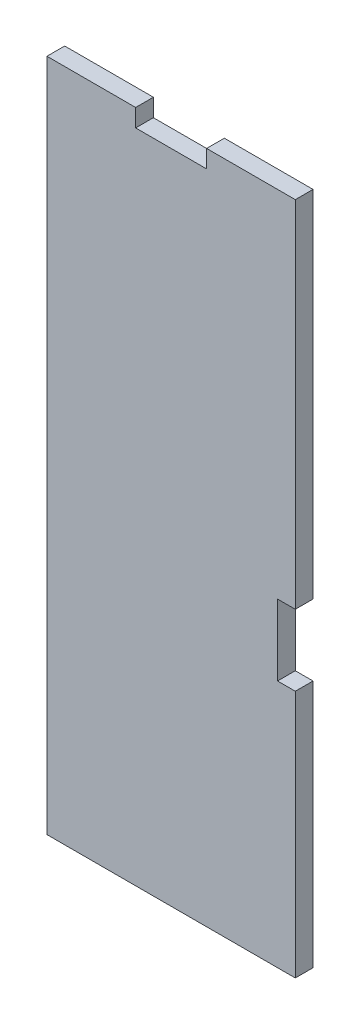
ISO-10303-21;
HEADER;
FILE_DESCRIPTION(('STEP AP214'),'2;1');
FILE_NAME('part.step','',(''),(''),'','','');
FILE_SCHEMA(('AUTOMOTIVE_DESIGN { 1 0 10303 214 1 1 1 1 }'));
ENDSEC;
DATA;
#1=APPLICATION_CONTEXT('core data for automotive mechanical design processes');
#2=APPLICATION_PROTOCOL_DEFINITION('international standard','automotive_design',2000,#1);
#3=PRODUCT_CONTEXT('',#1,'mechanical');
#4=PRODUCT('Part','Part','',(#3));
#5=PRODUCT_RELATED_PRODUCT_CATEGORY('part','',(#4));
#6=PRODUCT_DEFINITION_FORMATION('','',#4);
#7=PRODUCT_DEFINITION_CONTEXT('part definition',#1,'design');
#8=PRODUCT_DEFINITION('design','',#6,#7);
#9=PRODUCT_DEFINITION_SHAPE('','',#8);
#10=(LENGTH_UNIT() NAMED_UNIT(*) SI_UNIT(.MILLI.,.METRE.));
#11=(NAMED_UNIT(*) PLANE_ANGLE_UNIT() SI_UNIT($,.RADIAN.));
#12=(NAMED_UNIT(*) SI_UNIT($,.STERADIAN.) SOLID_ANGLE_UNIT());
#13=UNCERTAINTY_MEASURE_WITH_UNIT(LENGTH_MEASURE(1.E-05),#10,'distance_accuracy_value','');
#14=(GEOMETRIC_REPRESENTATION_CONTEXT(3) GLOBAL_UNCERTAINTY_ASSIGNED_CONTEXT((#13)) GLOBAL_UNIT_ASSIGNED_CONTEXT((#10,
#11,#12)) REPRESENTATION_CONTEXT('',''));
#15=CARTESIAN_POINT('',(0.,0.,0.));
#16=DIRECTION('',(0.,0.,1.));
#17=DIRECTION('',(1.,0.,0.));
#18=AXIS2_PLACEMENT_3D('',#15,#16,#17);
#19=CARTESIAN_POINT('',(-2.83761556371928,46.0831774343637,2.5));
#20=DIRECTION('',(-1.,0.,0.));
#21=DIRECTION('',(0.,0.,1.));
#22=AXIS2_PLACEMENT_3D('',#19,#20,#21);
#23=PLANE('',#22);
#24=DIRECTION('',(0.,1.,0.));
#25=VECTOR('',#24,1.);
#26=CARTESIAN_POINT('',(-2.83761556371928,46.0831774343637,0.));
#27=LINE('',#26,#25);
#28=CARTESIAN_POINT('',(-2.83761556371928,-3.91682256563627,0.));
#29=VERTEX_POINT('',#28);
#30=CARTESIAN_POINT('',(-2.83761556371928,46.0831774343637,0.));
#31=VERTEX_POINT('',#30);
#32=EDGE_CURVE('E157',#29,#31,#27,.T.);
#33=ORIENTED_EDGE('',*,*,#32,.T.);
#34=DIRECTION('',(0.,0.,-1.));
#35=VECTOR('',#34,1.);
#36=CARTESIAN_POINT('',(-2.83761556371928,46.0831774343637,2.5));
#37=LINE('',#36,#35);
#38=CARTESIAN_POINT('',(-2.83761556371928,46.0831774343637,2.5));
#39=VERTEX_POINT('',#38);
#40=EDGE_CURVE('E11',#39,#31,#37,.T.);
#41=ORIENTED_EDGE('',*,*,#40,.F.);
#42=DIRECTION('',(0.,1.,0.));
#43=VECTOR('',#42,1.);
#44=CARTESIAN_POINT('',(-2.83761556371928,46.0831774343637,2.5));
#45=LINE('',#44,#43);
#46=CARTESIAN_POINT('',(-2.83761556371928,-3.91682256563627,2.5));
#47=VERTEX_POINT('',#46);
#48=EDGE_CURVE('E179',#47,#39,#45,.T.);
#49=ORIENTED_EDGE('',*,*,#48,.F.);
#50=DIRECTION('',(0.,0.,-1.));
#51=VECTOR('',#50,1.);
#52=CARTESIAN_POINT('',(-2.83761556371928,-3.91682256563627,2.5));
#53=LINE('',#52,#51);
#54=EDGE_CURVE('E153',#47,#29,#53,.T.);
#55=ORIENTED_EDGE('',*,*,#54,.T.);
#56=EDGE_LOOP('',(#33,#41,#49,#55));
#57=FACE_BOUND('',#56,.T.);
#58=ADVANCED_FACE('F37',(#57),#23,.F.);
#59=CARTESIAN_POINT('',(-2.83761556371928,46.0831774343637,2.5));
#60=DIRECTION('',(0.,-1.,0.));
#61=DIRECTION('',(0.,0.,-1.));
#62=AXIS2_PLACEMENT_3D('',#59,#60,#61);
#63=PLANE('',#62);
#64=DIRECTION('',(-1.,0.,0.));
#65=VECTOR('',#64,1.);
#66=CARTESIAN_POINT('',(-2.83761556371928,46.0831774343637,0.));
#67=LINE('',#66,#65);
#68=CARTESIAN_POINT('',(-15.3376155637193,46.0831774343637,0.));
#69=VERTEX_POINT('',#68);
#70=EDGE_CURVE('E160',#31,#69,#67,.T.);
#71=ORIENTED_EDGE('',*,*,#70,.T.);
#72=DIRECTION('',(0.,0.,-1.));
#73=VECTOR('',#72,1.);
#74=CARTESIAN_POINT('',(-15.3376155637193,46.0831774343637,2.5));
#75=LINE('',#74,#73);
#76=CARTESIAN_POINT('',(-15.3376155637193,46.0831774343637,2.5));
#77=VERTEX_POINT('',#76);
#78=EDGE_CURVE('E45',#77,#69,#75,.T.);
#79=ORIENTED_EDGE('',*,*,#78,.F.);
#80=DIRECTION('',(-1.,0.,0.));
#81=VECTOR('',#80,1.);
#82=CARTESIAN_POINT('',(-2.83761556371928,46.0831774343637,2.5));
#83=LINE('',#82,#81);
#84=EDGE_CURVE('E108',#39,#77,#83,.T.);
#85=ORIENTED_EDGE('',*,*,#84,.F.);
#86=ORIENTED_EDGE('',*,*,#40,.T.);
#87=EDGE_LOOP('',(#71,#79,#85,#86));
#88=FACE_BOUND('',#87,.T.);
#89=ADVANCED_FACE('F257',(#88),#63,.F.);
#90=CARTESIAN_POINT('',(-15.3376155637193,43.5831774343637,2.5));
#91=DIRECTION('',(1.,0.,0.));
#92=DIRECTION('',(0.,0.,-1.));
#93=AXIS2_PLACEMENT_3D('',#90,#91,#92);
#94=PLANE('',#93);
#95=DIRECTION('',(0.,-1.,0.));
#96=VECTOR('',#95,1.);
#97=CARTESIAN_POINT('',(-15.3376155637193,43.5831774343637,0.));
#98=LINE('',#97,#96);
#99=CARTESIAN_POINT('',(-15.3376155637193,43.5831774343637,0.));
#100=VERTEX_POINT('',#99);
#101=EDGE_CURVE('E162',#69,#100,#98,.T.);
#102=ORIENTED_EDGE('',*,*,#101,.T.);
#103=DIRECTION('',(0.,0.,-1.));
#104=VECTOR('',#103,1.);
#105=CARTESIAN_POINT('',(-15.3376155637193,43.5831774343637,2.5));
#106=LINE('',#105,#104);
#107=CARTESIAN_POINT('',(-15.3376155637193,43.5831774343637,2.5));
#108=VERTEX_POINT('',#107);
#109=EDGE_CURVE('E198',#108,#100,#106,.T.);
#110=ORIENTED_EDGE('',*,*,#109,.F.);
#111=DIRECTION('',(0.,-1.,0.));
#112=VECTOR('',#111,1.);
#113=CARTESIAN_POINT('',(-15.3376155637193,43.5831774343637,2.5));
#114=LINE('',#113,#112);
#115=EDGE_CURVE('E206',#77,#108,#114,.T.);
#116=ORIENTED_EDGE('',*,*,#115,.F.);
#117=ORIENTED_EDGE('',*,*,#78,.T.);
#118=EDGE_LOOP('',(#102,#110,#116,#117));
#119=FACE_BOUND('',#118,.T.);
#120=ADVANCED_FACE('F204',(#119),#94,.F.);
#121=CARTESIAN_POINT('',(-25.3376155637193,43.5831774343637,2.5));
#122=DIRECTION('',(0.,-1.,0.));
#123=DIRECTION('',(0.,0.,-1.));
#124=AXIS2_PLACEMENT_3D('',#121,#122,#123);
#125=PLANE('',#124);
#126=DIRECTION('',(-1.,0.,0.));
#127=VECTOR('',#126,1.);
#128=CARTESIAN_POINT('',(-25.3376155637193,43.5831774343637,0.));
#129=LINE('',#128,#127);
#130=CARTESIAN_POINT('',(-25.3376155637193,43.5831774343637,0.));
#131=VERTEX_POINT('',#130);
#132=EDGE_CURVE('E164',#100,#131,#129,.T.);
#133=ORIENTED_EDGE('',*,*,#132,.T.);
#134=DIRECTION('',(0.,0.,-1.));
#135=VECTOR('',#134,1.);
#136=CARTESIAN_POINT('',(-25.3376155637193,43.5831774343637,2.5));
#137=LINE('',#136,#135);
#138=CARTESIAN_POINT('',(-25.3376155637193,43.5831774343637,2.5));
#139=VERTEX_POINT('',#138);
#140=EDGE_CURVE('E195',#139,#131,#137,.T.);
#141=ORIENTED_EDGE('',*,*,#140,.F.);
#142=DIRECTION('',(-1.,0.,0.));
#143=VECTOR('',#142,1.);
#144=CARTESIAN_POINT('',(-25.3376155637193,43.5831774343637,2.5));
#145=LINE('',#144,#143);
#146=EDGE_CURVE('E224',#108,#139,#145,.T.);
#147=ORIENTED_EDGE('',*,*,#146,.F.);
#148=ORIENTED_EDGE('',*,*,#109,.T.);
#149=EDGE_LOOP('',(#133,#141,#147,#148));
#150=FACE_BOUND('',#149,.T.);
#151=ADVANCED_FACE('F215',(#150),#125,.F.);
#152=CARTESIAN_POINT('',(-25.3376155637193,43.5831774343637,2.5));
#153=DIRECTION('',(-1.,0.,0.));
#154=DIRECTION('',(0.,0.,1.));
#155=AXIS2_PLACEMENT_3D('',#152,#153,#154);
#156=PLANE('',#155);
#157=DIRECTION('',(0.,1.,0.));
#158=VECTOR('',#157,1.);
#159=CARTESIAN_POINT('',(-25.3376155637193,43.5831774343637,0.));
#160=LINE('',#159,#158);
#161=CARTESIAN_POINT('',(-25.3376155637193,46.0831774343637,0.));
#162=VERTEX_POINT('',#161);
#163=EDGE_CURVE('E166',#131,#162,#160,.T.);
#164=ORIENTED_EDGE('',*,*,#163,.T.);
#165=DIRECTION('',(0.,0.,-1.));
#166=VECTOR('',#165,1.);
#167=CARTESIAN_POINT('',(-25.3376155637193,46.0831774343637,2.5));
#168=LINE('',#167,#166);
#169=CARTESIAN_POINT('',(-25.3376155637193,46.0831774343637,2.5));
#170=VERTEX_POINT('',#169);
#171=EDGE_CURVE('E192',#170,#162,#168,.T.);
#172=ORIENTED_EDGE('',*,*,#171,.F.);
#173=DIRECTION('',(0.,1.,0.));
#174=VECTOR('',#173,1.);
#175=CARTESIAN_POINT('',(-25.3376155637193,43.5831774343637,2.5));
#176=LINE('',#175,#174);
#177=EDGE_CURVE('E221',#139,#170,#176,.T.);
#178=ORIENTED_EDGE('',*,*,#177,.F.);
#179=ORIENTED_EDGE('',*,*,#140,.T.);
#180=EDGE_LOOP('',(#164,#172,#178,#179));
#181=FACE_BOUND('',#180,.T.);
#182=ADVANCED_FACE('F219',(#181),#156,.F.);
#183=CARTESIAN_POINT('',(-25.3376155637193,46.0831774343637,2.5));
#184=DIRECTION('',(0.,-1.,0.));
#185=DIRECTION('',(0.,0.,-1.));
#186=AXIS2_PLACEMENT_3D('',#183,#184,#185);
#187=PLANE('',#186);
#188=DIRECTION('',(-1.,0.,0.));
#189=VECTOR('',#188,1.);
#190=CARTESIAN_POINT('',(-25.3376155637193,46.0831774343637,0.));
#191=LINE('',#190,#189);
#192=CARTESIAN_POINT('',(-37.8376155637193,46.0831774343637,0.));
#193=VERTEX_POINT('',#192);
#194=EDGE_CURVE('E168',#162,#193,#191,.T.);
#195=ORIENTED_EDGE('',*,*,#194,.T.);
#196=DIRECTION('',(0.,0.,-1.));
#197=VECTOR('',#196,1.);
#198=CARTESIAN_POINT('',(-37.8376155637193,46.0831774343637,2.5));
#199=LINE('',#198,#197);
#200=CARTESIAN_POINT('',(-37.8376155637193,46.0831774343637,2.5));
#201=VERTEX_POINT('',#200);
#202=EDGE_CURVE('E189',#201,#193,#199,.T.);
#203=ORIENTED_EDGE('',*,*,#202,.F.);
#204=DIRECTION('',(-1.,0.,0.));
#205=VECTOR('',#204,1.);
#206=CARTESIAN_POINT('',(-25.3376155637193,46.0831774343637,2.5));
#207=LINE('',#206,#205);
#208=EDGE_CURVE('E223',#170,#201,#207,.T.);
#209=ORIENTED_EDGE('',*,*,#208,.F.);
#210=ORIENTED_EDGE('',*,*,#171,.T.);
#211=EDGE_LOOP('',(#195,#203,#209,#210));
#212=FACE_BOUND('',#211,.T.);
#213=ADVANCED_FACE('F270',(#212),#187,.F.);
#214=CARTESIAN_POINT('',(-37.8376155637193,-48.9168225656363,2.5));
#215=DIRECTION('',(1.,0.,0.));
#216=DIRECTION('',(0.,0.,-1.));
#217=AXIS2_PLACEMENT_3D('',#214,#215,#216);
#218=PLANE('',#217);
#219=DIRECTION('',(0.,-1.,0.));
#220=VECTOR('',#219,1.);
#221=CARTESIAN_POINT('',(-37.8376155637193,-48.9168225656363,0.));
#222=LINE('',#221,#220);
#223=CARTESIAN_POINT('',(-37.8376155637193,-48.9168225656363,0.));
#224=VERTEX_POINT('',#223);
#225=EDGE_CURVE('E170',#193,#224,#222,.T.);
#226=ORIENTED_EDGE('',*,*,#225,.T.);
#227=DIRECTION('',(0.,0.,-1.));
#228=VECTOR('',#227,1.);
#229=CARTESIAN_POINT('',(-37.8376155637193,-48.9168225656363,2.5));
#230=LINE('',#229,#228);
#231=CARTESIAN_POINT('',(-37.8376155637193,-48.9168225656363,2.5));
#232=VERTEX_POINT('',#231);
#233=EDGE_CURVE('E186',#232,#224,#230,.T.);
#234=ORIENTED_EDGE('',*,*,#233,.F.);
#235=DIRECTION('',(0.,-1.,0.));
#236=VECTOR('',#235,1.);
#237=CARTESIAN_POINT('',(-37.8376155637193,-48.9168225656363,2.5));
#238=LINE('',#237,#236);
#239=EDGE_CURVE('E226',#201,#232,#238,.T.);
#240=ORIENTED_EDGE('',*,*,#239,.F.);
#241=ORIENTED_EDGE('',*,*,#202,.T.);
#242=EDGE_LOOP('',(#226,#234,#240,#241));
#243=FACE_BOUND('',#242,.T.);
#244=ADVANCED_FACE('F273',(#243),#218,.F.);
#245=CARTESIAN_POINT('',(-2.83761556371928,-48.9168225656363,2.5));
#246=DIRECTION('',(0.,1.,0.));
#247=DIRECTION('',(0.,0.,1.));
#248=AXIS2_PLACEMENT_3D('',#245,#246,#247);
#249=PLANE('',#248);
#250=DIRECTION('',(1.,0.,0.));
#251=VECTOR('',#250,1.);
#252=CARTESIAN_POINT('',(-2.83761556371928,-48.9168225656363,0.));
#253=LINE('',#252,#251);
#254=CARTESIAN_POINT('',(-2.83761556371928,-48.9168225656363,0.));
#255=VERTEX_POINT('',#254);
#256=EDGE_CURVE('E172',#224,#255,#253,.T.);
#257=ORIENTED_EDGE('',*,*,#256,.T.);
#258=DIRECTION('',(0.,0.,-1.));
#259=VECTOR('',#258,1.);
#260=CARTESIAN_POINT('',(-2.83761556371928,-48.9168225656363,2.5));
#261=LINE('',#260,#259);
#262=CARTESIAN_POINT('',(-2.83761556371928,-48.9168225656363,2.5));
#263=VERTEX_POINT('',#262);
#264=EDGE_CURVE('E183',#263,#255,#261,.T.);
#265=ORIENTED_EDGE('',*,*,#264,.F.);
#266=DIRECTION('',(1.,0.,0.));
#267=VECTOR('',#266,1.);
#268=CARTESIAN_POINT('',(-2.83761556371928,-48.9168225656363,2.5));
#269=LINE('',#268,#267);
#270=EDGE_CURVE('E232',#232,#263,#269,.T.);
#271=ORIENTED_EDGE('',*,*,#270,.F.);
#272=ORIENTED_EDGE('',*,*,#233,.T.);
#273=EDGE_LOOP('',(#257,#265,#271,#272));
#274=FACE_BOUND('',#273,.T.);
#275=ADVANCED_FACE('F238',(#274),#249,.F.);
#276=CARTESIAN_POINT('',(-2.83761556371928,-13.9168225656363,2.5));
#277=DIRECTION('',(-1.,0.,0.));
#278=DIRECTION('',(0.,0.,1.));
#279=AXIS2_PLACEMENT_3D('',#276,#277,#278);
#280=PLANE('',#279);
#281=DIRECTION('',(0.,1.,0.));
#282=VECTOR('',#281,1.);
#283=CARTESIAN_POINT('',(-2.83761556371928,-13.9168225656363,0.));
#284=LINE('',#283,#282);
#285=CARTESIAN_POINT('',(-2.83761556371928,-13.9168225656363,0.));
#286=VERTEX_POINT('',#285);
#287=EDGE_CURVE('E174',#255,#286,#284,.T.);
#288=ORIENTED_EDGE('',*,*,#287,.T.);
#289=DIRECTION('',(0.,0.,-1.));
#290=VECTOR('',#289,1.);
#291=CARTESIAN_POINT('',(-2.83761556371928,-13.9168225656363,2.5));
#292=LINE('',#291,#290);
#293=CARTESIAN_POINT('',(-2.83761556371928,-13.9168225656363,2.5));
#294=VERTEX_POINT('',#293);
#295=EDGE_CURVE('E148',#294,#286,#292,.T.);
#296=ORIENTED_EDGE('',*,*,#295,.F.);
#297=DIRECTION('',(0.,1.,0.));
#298=VECTOR('',#297,1.);
#299=CARTESIAN_POINT('',(-2.83761556371928,-13.9168225656363,2.5));
#300=LINE('',#299,#298);
#301=EDGE_CURVE('E139',#263,#294,#300,.T.);
#302=ORIENTED_EDGE('',*,*,#301,.F.);
#303=ORIENTED_EDGE('',*,*,#264,.T.);
#304=EDGE_LOOP('',(#288,#296,#302,#303));
#305=FACE_BOUND('',#304,.T.);
#306=ADVANCED_FACE('F242',(#305),#280,.F.);
#307=CARTESIAN_POINT('',(-5.33761556371928,-13.9168225656363,2.5));
#308=DIRECTION('',(0.,-1.,0.));
#309=DIRECTION('',(0.,0.,-1.));
#310=AXIS2_PLACEMENT_3D('',#307,#308,#309);
#311=PLANE('',#310);
#312=DIRECTION('',(-1.,0.,0.));
#313=VECTOR('',#312,1.);
#314=CARTESIAN_POINT('',(-5.33761556371928,-13.9168225656363,0.));
#315=LINE('',#314,#313);
#316=CARTESIAN_POINT('',(-5.33761556371928,-13.9168225656363,0.));
#317=VERTEX_POINT('',#316);
#318=EDGE_CURVE('E147',#286,#317,#315,.T.);
#319=ORIENTED_EDGE('',*,*,#318,.T.);
#320=DIRECTION('',(0.,0.,-1.));
#321=VECTOR('',#320,1.);
#322=CARTESIAN_POINT('',(-5.33761556371928,-13.9168225656363,2.5));
#323=LINE('',#322,#321);
#324=CARTESIAN_POINT('',(-5.33761556371928,-13.9168225656363,2.5));
#325=VERTEX_POINT('',#324);
#326=EDGE_CURVE('E144',#325,#317,#323,.T.);
#327=ORIENTED_EDGE('',*,*,#326,.F.);
#328=DIRECTION('',(-1.,0.,0.));
#329=VECTOR('',#328,1.);
#330=CARTESIAN_POINT('',(-5.33761556371928,-13.9168225656363,2.5));
#331=LINE('',#330,#329);
#332=EDGE_CURVE('E133',#294,#325,#331,.T.);
#333=ORIENTED_EDGE('',*,*,#332,.F.);
#334=ORIENTED_EDGE('',*,*,#295,.T.);
#335=EDGE_LOOP('',(#319,#327,#333,#334));
#336=FACE_BOUND('',#335,.T.);
#337=ADVANCED_FACE('F145',(#336),#311,.F.);
#338=CARTESIAN_POINT('',(-5.33761556371928,-3.91682256563627,2.5));
#339=DIRECTION('',(-1.,0.,0.));
#340=DIRECTION('',(0.,0.,1.));
#341=AXIS2_PLACEMENT_3D('',#338,#339,#340);
#342=PLANE('',#341);
#343=DIRECTION('',(0.,1.,0.));
#344=VECTOR('',#343,1.);
#345=CARTESIAN_POINT('',(-5.33761556371928,-3.91682256563627,0.));
#346=LINE('',#345,#344);
#347=CARTESIAN_POINT('',(-5.33761556371928,-3.91682256563627,0.));
#348=VERTEX_POINT('',#347);
#349=EDGE_CURVE('E94',#317,#348,#346,.T.);
#350=ORIENTED_EDGE('',*,*,#349,.T.);
#351=DIRECTION('',(0.,0.,-1.));
#352=VECTOR('',#351,1.);
#353=CARTESIAN_POINT('',(-5.33761556371928,-3.91682256563627,2.5));
#354=LINE('',#353,#352);
#355=CARTESIAN_POINT('',(-5.33761556371928,-3.91682256563627,2.5));
#356=VERTEX_POINT('',#355);
#357=EDGE_CURVE('E149',#356,#348,#354,.T.);
#358=ORIENTED_EDGE('',*,*,#357,.F.);
#359=DIRECTION('',(0.,1.,0.));
#360=VECTOR('',#359,1.);
#361=CARTESIAN_POINT('',(-5.33761556371928,-3.91682256563627,2.5));
#362=LINE('',#361,#360);
#363=EDGE_CURVE('E137',#325,#356,#362,.T.);
#364=ORIENTED_EDGE('',*,*,#363,.F.);
#365=ORIENTED_EDGE('',*,*,#326,.T.);
#366=EDGE_LOOP('',(#350,#358,#364,#365));
#367=FACE_BOUND('',#366,.T.);
#368=ADVANCED_FACE('F151',(#367),#342,.F.);
#369=CARTESIAN_POINT('',(-2.83761556371928,-3.91682256563627,2.5));
#370=DIRECTION('',(0.,1.,0.));
#371=DIRECTION('',(0.,0.,1.));
#372=AXIS2_PLACEMENT_3D('',#369,#370,#371);
#373=PLANE('',#372);
#374=DIRECTION('',(1.,0.,0.));
#375=VECTOR('',#374,1.);
#376=CARTESIAN_POINT('',(-2.83761556371928,-3.91682256563627,0.));
#377=LINE('',#376,#375);
#378=EDGE_CURVE('E100',#348,#29,#377,.T.);
#379=ORIENTED_EDGE('',*,*,#378,.T.);
#380=ORIENTED_EDGE('',*,*,#54,.F.);
#381=DIRECTION('',(1.,0.,0.));
#382=VECTOR('',#381,1.);
#383=CARTESIAN_POINT('',(-2.83761556371928,-3.91682256563627,2.5));
#384=LINE('',#383,#382);
#385=EDGE_CURVE('E53',#356,#47,#384,.T.);
#386=ORIENTED_EDGE('',*,*,#385,.F.);
#387=ORIENTED_EDGE('',*,*,#357,.T.);
#388=EDGE_LOOP('',(#379,#380,#386,#387));
#389=FACE_BOUND('',#388,.T.);
#390=ADVANCED_FACE('F246',(#389),#373,.F.);
#391=CARTESIAN_POINT('',(0.,0.,2.5));
#392=DIRECTION('',(0.,0.,-1.));
#393=DIRECTION('',(-1.,0.,0.));
#394=AXIS2_PLACEMENT_3D('',#391,#392,#393);
#395=PLANE('',#394);
#396=ORIENTED_EDGE('',*,*,#48,.T.);
#397=ORIENTED_EDGE('',*,*,#84,.T.);
#398=ORIENTED_EDGE('',*,*,#115,.T.);
#399=ORIENTED_EDGE('',*,*,#146,.T.);
#400=ORIENTED_EDGE('',*,*,#177,.T.);
#401=ORIENTED_EDGE('',*,*,#208,.T.);
#402=ORIENTED_EDGE('',*,*,#239,.T.);
#403=ORIENTED_EDGE('',*,*,#270,.T.);
#404=ORIENTED_EDGE('',*,*,#301,.T.);
#405=ORIENTED_EDGE('',*,*,#332,.T.);
#406=ORIENTED_EDGE('',*,*,#363,.T.);
#407=ORIENTED_EDGE('',*,*,#385,.T.);
#408=EDGE_LOOP('',(#396,#397,#398,#399,#400,#401,#402,#403,#404,#405,#406,#407));
#409=FACE_BOUND('',#408,.T.);
#410=ADVANCED_FACE('F135',(#409),#395,.F.);
#411=CARTESIAN_POINT('',(0.,0.,0.));
#412=DIRECTION('',(0.,0.,-1.));
#413=DIRECTION('',(-1.,0.,0.));
#414=AXIS2_PLACEMENT_3D('',#411,#412,#413);
#415=PLANE('',#414);
#416=ORIENTED_EDGE('',*,*,#32,.F.);
#417=ORIENTED_EDGE('',*,*,#378,.F.);
#418=ORIENTED_EDGE('',*,*,#349,.F.);
#419=ORIENTED_EDGE('',*,*,#318,.F.);
#420=ORIENTED_EDGE('',*,*,#287,.F.);
#421=ORIENTED_EDGE('',*,*,#256,.F.);
#422=ORIENTED_EDGE('',*,*,#225,.F.);
#423=ORIENTED_EDGE('',*,*,#194,.F.);
#424=ORIENTED_EDGE('',*,*,#163,.F.);
#425=ORIENTED_EDGE('',*,*,#132,.F.);
#426=ORIENTED_EDGE('',*,*,#101,.F.);
#427=ORIENTED_EDGE('',*,*,#70,.F.);
#428=EDGE_LOOP('',(#416,#417,#418,#419,#420,#421,#422,#423,#424,#425,#426,#427));
#429=FACE_BOUND('',#428,.T.);
#430=ADVANCED_FACE('F210',(#429),#415,.T.);
#431=CLOSED_SHELL('',(#58,#89,#120,#151,#182,#213,#244,#275,#306,#337,#368,#390,#410,#430));
#432=MANIFOLD_SOLID_BREP('B2',#431);
#433=ADVANCED_BREP_SHAPE_REPRESENTATION('',(#18,#432),#14);
#434=SHAPE_DEFINITION_REPRESENTATION(#9,#433);
ENDSEC;
END-ISO-10303-21;
